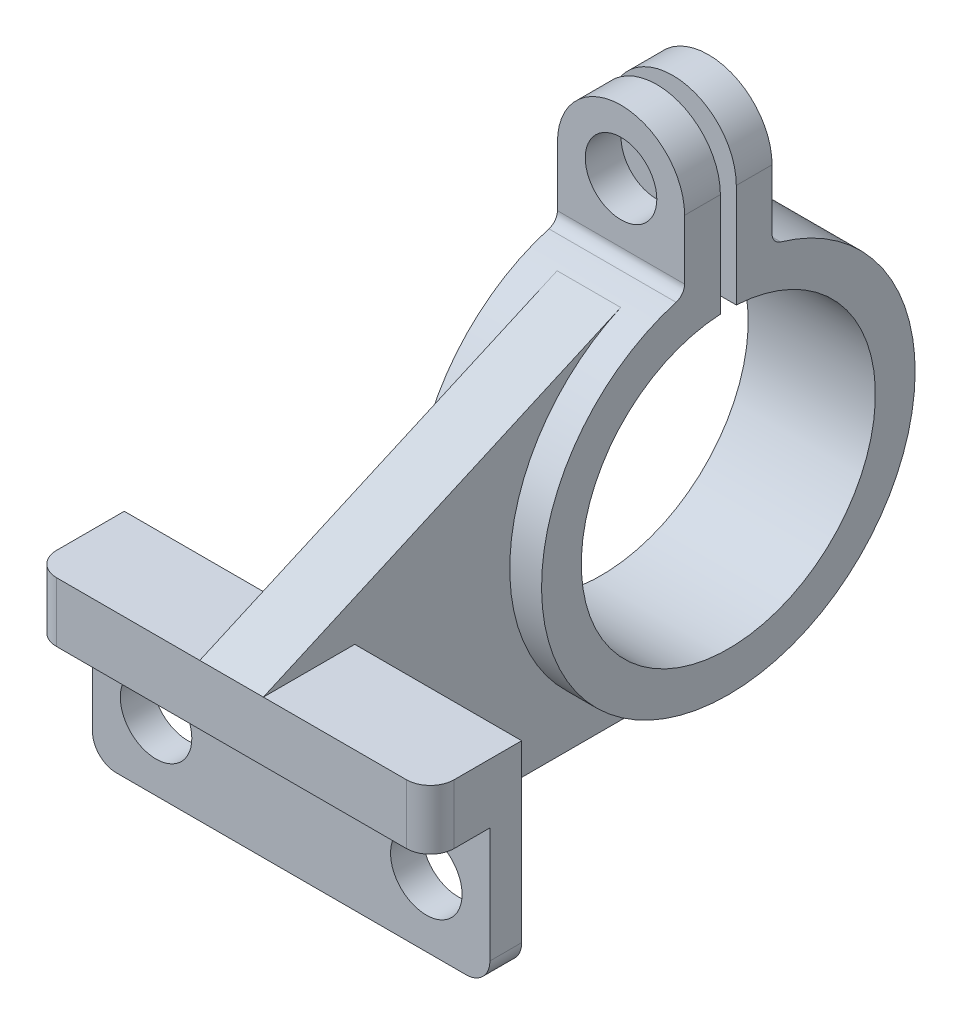
ISO-10303-21;
HEADER;
FILE_DESCRIPTION(('STEP AP214'),'2;1');
FILE_NAME('part.step','',(''),(''),'','','');
FILE_SCHEMA(('AUTOMOTIVE_DESIGN { 1 0 10303 214 1 1 1 1 }'));
ENDSEC;
DATA;
#1=APPLICATION_CONTEXT('core data for automotive mechanical design processes');
#2=APPLICATION_PROTOCOL_DEFINITION('international standard','automotive_design',2000,#1);
#3=PRODUCT_CONTEXT('',#1,'mechanical');
#4=PRODUCT('Part','Part','',(#3));
#5=PRODUCT_RELATED_PRODUCT_CATEGORY('part','',(#4));
#6=PRODUCT_DEFINITION_FORMATION('','',#4);
#7=PRODUCT_DEFINITION_CONTEXT('part definition',#1,'design');
#8=PRODUCT_DEFINITION('design','',#6,#7);
#9=PRODUCT_DEFINITION_SHAPE('','',#8);
#10=(LENGTH_UNIT() NAMED_UNIT(*) SI_UNIT(.MILLI.,.METRE.));
#11=(NAMED_UNIT(*) PLANE_ANGLE_UNIT() SI_UNIT($,.RADIAN.));
#12=(NAMED_UNIT(*) SI_UNIT($,.STERADIAN.) SOLID_ANGLE_UNIT());
#13=UNCERTAINTY_MEASURE_WITH_UNIT(LENGTH_MEASURE(1.E-05),#10,'distance_accuracy_value','');
#14=(GEOMETRIC_REPRESENTATION_CONTEXT(3) GLOBAL_UNCERTAINTY_ASSIGNED_CONTEXT((#13)) GLOBAL_UNIT_ASSIGNED_CONTEXT((#10,
#11,#12)) REPRESENTATION_CONTEXT('',''));
#15=CARTESIAN_POINT('',(0.,0.,0.));
#16=DIRECTION('',(0.,0.,1.));
#17=DIRECTION('',(1.,0.,0.));
#18=AXIS2_PLACEMENT_3D('',#15,#16,#17);
#19=CARTESIAN_POINT('',(0.,63.,11.));
#20=DIRECTION('',(0.,0.,-1.));
#21=DIRECTION('',(-1.,0.,0.));
#22=AXIS2_PLACEMENT_3D('',#19,#20,#21);
#23=CYLINDRICAL_SURFACE('',#22,16.);
#24=DIRECTION('',(0.,0.,-1.));
#25=VECTOR('',#24,1.);
#26=CARTESIAN_POINT('',(-16.,63.,11.));
#27=LINE('',#26,#25);
#28=CARTESIAN_POINT('',(-16.,63.,-2.));
#29=VERTEX_POINT('',#28);
#30=CARTESIAN_POINT('',(-16.,63.,-11.));
#31=VERTEX_POINT('',#30);
#32=EDGE_CURVE('E359',#29,#31,#27,.T.);
#33=ORIENTED_EDGE('',*,*,#32,.F.);
#34=CARTESIAN_POINT('',(0.,63.,-2.));
#35=DIRECTION('',(0.,0.,-1.));
#36=DIRECTION('',(0.,1.,0.));
#37=AXIS2_PLACEMENT_3D('',#34,#35,#36);
#38=CIRCLE('',#37,16.);
#39=CARTESIAN_POINT('',(16.,63.,-2.));
#40=VERTEX_POINT('',#39);
#41=EDGE_CURVE('E341',#29,#40,#38,.T.);
#42=ORIENTED_EDGE('',*,*,#41,.T.);
#43=DIRECTION('',(0.,0.,-1.));
#44=VECTOR('',#43,1.);
#45=CARTESIAN_POINT('',(16.,63.,11.));
#46=LINE('',#45,#44);
#47=CARTESIAN_POINT('',(16.,63.,-11.));
#48=VERTEX_POINT('',#47);
#49=EDGE_CURVE('E369',#40,#48,#46,.T.);
#50=ORIENTED_EDGE('',*,*,#49,.T.);
#51=CARTESIAN_POINT('',(0.,63.,-11.));
#52=DIRECTION('',(0.,0.,1.));
#53=DIRECTION('',(-1.,0.,0.));
#54=AXIS2_PLACEMENT_3D('',#51,#52,#53);
#55=CIRCLE('',#54,16.);
#56=EDGE_CURVE('E361',#48,#31,#55,.T.);
#57=ORIENTED_EDGE('',*,*,#56,.T.);
#58=EDGE_LOOP('',(#33,#42,#50,#57));
#59=FACE_BOUND('',#58,.T.);
#60=ADVANCED_FACE('F35',(#59),#23,.T.);
#61=CARTESIAN_POINT('',(0.,63.,11.));
#62=DIRECTION('',(0.,0.,-1.));
#63=DIRECTION('',(-1.,0.,0.));
#64=AXIS2_PLACEMENT_3D('',#61,#62,#63);
#65=CYLINDRICAL_SURFACE('',#64,9.);
#66=CARTESIAN_POINT('',(0.,63.,-2.));
#67=DIRECTION('',(0.,0.,-1.));
#68=DIRECTION('',(0.,1.,0.));
#69=AXIS2_PLACEMENT_3D('',#66,#67,#68);
#70=CIRCLE('',#69,9.);
#71=CARTESIAN_POINT('',(0.,72.,-2.));
#72=VERTEX_POINT('',#71);
#73=EDGE_CURVE('E340',#72,#72,#70,.T.);
#74=ORIENTED_EDGE('',*,*,#73,.F.);
#75=EDGE_LOOP('',(#74));
#76=FACE_BOUND('',#75,.T.);
#77=CARTESIAN_POINT('',(0.,63.,-11.));
#78=DIRECTION('',(0.,0.,1.));
#79=DIRECTION('',(1.,0.,0.));
#80=AXIS2_PLACEMENT_3D('',#77,#78,#79);
#81=CIRCLE('',#80,9.);
#82=CARTESIAN_POINT('',(9.,63.,-11.));
#83=VERTEX_POINT('',#82);
#84=EDGE_CURVE('E344',#83,#83,#81,.T.);
#85=ORIENTED_EDGE('',*,*,#84,.F.);
#86=EDGE_LOOP('',(#85));
#87=FACE_BOUND('',#86,.T.);
#88=ADVANCED_FACE('F458',(#76,#87),#65,.F.);
#89=CARTESIAN_POINT('',(16.,0.,0.));
#90=DIRECTION('',(-1.,0.,0.));
#91=DIRECTION('',(0.,0.,1.));
#92=AXIS2_PLACEMENT_3D('',#89,#90,#91);
#93=CYLINDRICAL_SURFACE('',#92,47.);
#94=DIRECTION('',(-1.,0.,0.));
#95=VECTOR('',#94,1.);
#96=CARTESIAN_POINT('',(8.,42.9511849566096,19.0839123563047));
#97=LINE('',#96,#95);
#98=CARTESIAN_POINT('',(8.,42.9511849636541,19.0839123404499));
#99=VERTEX_POINT('',#98);
#100=CARTESIAN_POINT('',(-8.,42.9511849636541,19.0839123404499));
#101=VERTEX_POINT('',#100);
#102=EDGE_CURVE('E55',#99,#101,#97,.T.);
#103=ORIENTED_EDGE('',*,*,#102,.F.);
#104=CARTESIAN_POINT('',(8.,-3.68080566026663E-09,1.73493233668331E-08));
#105=DIRECTION('',(-1.,0.,0.));
#106=DIRECTION('',(0.,0.,-1.));
#107=AXIS2_PLACEMENT_3D('',#104,#105,#106);
#108=CIRCLE('',#107,46.9999999963192);
#109=CARTESIAN_POINT('',(8.,-47.,0.));
#110=VERTEX_POINT('',#109);
#111=EDGE_CURVE('E50',#110,#99,#108,.T.);
#112=ORIENTED_EDGE('',*,*,#111,.F.);
#113=DIRECTION('',(-1.,0.,0.));
#114=VECTOR('',#113,1.);
#115=CARTESIAN_POINT('',(8.,-47.,0.));
#116=LINE('',#115,#114);
#117=CARTESIAN_POINT('',(-8.,-47.,0.));
#118=VERTEX_POINT('',#117);
#119=EDGE_CURVE('E319',#110,#118,#116,.T.);
#120=ORIENTED_EDGE('',*,*,#119,.T.);
#121=CARTESIAN_POINT('',(-8.,-3.68080566026663E-09,1.73493233668331E-08));
#122=DIRECTION('',(-1.,0.,0.));
#123=DIRECTION('',(0.,0.,-1.));
#124=AXIS2_PLACEMENT_3D('',#121,#122,#123);
#125=CIRCLE('',#124,46.9999999963192);
#126=EDGE_CURVE('E313',#118,#101,#125,.T.);
#127=ORIENTED_EDGE('',*,*,#126,.T.);
#128=EDGE_LOOP('',(#103,#112,#120,#127));
#129=FACE_BOUND('',#128,.T.);
#130=CARTESIAN_POINT('',(-16.,0.,0.));
#131=DIRECTION('',(1.,0.,0.));
#132=DIRECTION('',(0.,0.,-1.));
#133=AXIS2_PLACEMENT_3D('',#130,#131,#132);
#134=CIRCLE('',#133,47.);
#135=CARTESIAN_POINT('',(-16.,45.12,13.16));
#136=VERTEX_POINT('',#135);
#137=CARTESIAN_POINT('',(-16.,45.12,-13.16));
#138=VERTEX_POINT('',#137);
#139=EDGE_CURVE('E377',#136,#138,#134,.T.);
#140=ORIENTED_EDGE('',*,*,#139,.T.);
#141=DIRECTION('',(-1.,0.,0.));
#142=VECTOR('',#141,1.);
#143=CARTESIAN_POINT('',(16.,45.12,-13.16));
#144=LINE('',#143,#142);
#145=CARTESIAN_POINT('',(16.,45.12,-13.16));
#146=VERTEX_POINT('',#145);
#147=EDGE_CURVE('E391',#138,#146,#144,.F.);
#148=ORIENTED_EDGE('',*,*,#147,.T.);
#149=CARTESIAN_POINT('',(16.,0.,0.));
#150=DIRECTION('',(1.,0.,0.));
#151=DIRECTION('',(0.,0.,-1.));
#152=AXIS2_PLACEMENT_3D('',#149,#150,#151);
#153=CIRCLE('',#152,47.);
#154=CARTESIAN_POINT('',(16.,45.12,13.16));
#155=VERTEX_POINT('',#154);
#156=EDGE_CURVE('E380',#155,#146,#153,.T.);
#157=ORIENTED_EDGE('',*,*,#156,.F.);
#158=DIRECTION('',(-1.,0.,0.));
#159=VECTOR('',#158,1.);
#160=CARTESIAN_POINT('',(16.,45.12,13.16));
#161=LINE('',#160,#159);
#162=EDGE_CURVE('E383',#155,#136,#161,.T.);
#163=ORIENTED_EDGE('',*,*,#162,.T.);
#164=EDGE_LOOP('',(#140,#148,#157,#163));
#165=FACE_BOUND('',#164,.T.);
#166=ADVANCED_FACE('F412',(#129,#165),#93,.T.);
#167=CARTESIAN_POINT('',(16.,0.,0.));
#168=DIRECTION('',(1.,0.,0.));
#169=DIRECTION('',(0.,0.,-1.));
#170=AXIS2_PLACEMENT_3D('',#167,#168,#169);
#171=PLANE('',#170);
#172=DIRECTION('',(0.,1.,0.));
#173=VECTOR('',#172,1.);
#174=CARTESIAN_POINT('',(16.,36.9459064038223,-2.));
#175=LINE('',#174,#173);
#176=CARTESIAN_POINT('',(16.,36.9459064038223,-2.));
#177=VERTEX_POINT('',#176);
#178=EDGE_CURVE('E326',#177,#40,#175,.T.);
#179=ORIENTED_EDGE('',*,*,#178,.F.);
#180=CARTESIAN_POINT('',(16.,0.,0.));
#181=DIRECTION('',(1.,0.,0.));
#182=DIRECTION('',(0.,0.,-1.));
#183=AXIS2_PLACEMENT_3D('',#180,#181,#182);
#184=CIRCLE('',#183,37.);
#185=CARTESIAN_POINT('',(16.,36.9459064038223,2.));
#186=VERTEX_POINT('',#185);
#187=EDGE_CURVE('E374',#186,#177,#184,.T.);
#188=ORIENTED_EDGE('',*,*,#187,.F.);
#189=DIRECTION('',(0.,-1.,0.));
#190=VECTOR('',#189,1.);
#191=CARTESIAN_POINT('',(16.,81.9459064038223,2.00000000000001));
#192=LINE('',#191,#190);
#193=CARTESIAN_POINT('',(16.,63.,2.));
#194=VERTEX_POINT('',#193);
#195=EDGE_CURVE('E321',#194,#186,#192,.T.);
#196=ORIENTED_EDGE('',*,*,#195,.F.);
#197=CARTESIAN_POINT('',(16.,63.,11.));
#198=VERTEX_POINT('',#197);
#199=EDGE_CURVE('E370',#198,#194,#46,.T.);
#200=ORIENTED_EDGE('',*,*,#199,.F.);
#201=DIRECTION('',(0.,1.,0.));
#202=VECTOR('',#201,1.);
#203=CARTESIAN_POINT('',(16.,63.,11.));
#204=LINE('',#203,#202);
#205=CARTESIAN_POINT('',(16.,48.,11.));
#206=VERTEX_POINT('',#205);
#207=EDGE_CURVE('E351',#206,#198,#204,.T.);
#208=ORIENTED_EDGE('',*,*,#207,.F.);
#209=CARTESIAN_POINT('',(16.,48.,14.));
#210=DIRECTION('',(1.,0.,0.));
#211=DIRECTION('',(0.,0.,-1.));
#212=AXIS2_PLACEMENT_3D('',#209,#210,#211);
#213=CIRCLE('',#212,3.);
#214=EDGE_CURVE('E43',#206,#155,#213,.F.);
#215=ORIENTED_EDGE('',*,*,#214,.T.);
#216=ORIENTED_EDGE('',*,*,#156,.T.);
#217=CARTESIAN_POINT('',(16.,48.,-14.));
#218=DIRECTION('',(1.,0.,0.));
#219=DIRECTION('',(0.,0.,-1.));
#220=AXIS2_PLACEMENT_3D('',#217,#218,#219);
#221=CIRCLE('',#220,3.);
#222=CARTESIAN_POINT('',(16.,48.,-11.));
#223=VERTEX_POINT('',#222);
#224=EDGE_CURVE('E399',#146,#223,#221,.F.);
#225=ORIENTED_EDGE('',*,*,#224,.T.);
#226=DIRECTION('',(0.,1.,0.));
#227=VECTOR('',#226,1.);
#228=CARTESIAN_POINT('',(16.,63.,-11.));
#229=LINE('',#228,#227);
#230=EDGE_CURVE('E348',#223,#48,#229,.T.);
#231=ORIENTED_EDGE('',*,*,#230,.T.);
#232=ORIENTED_EDGE('',*,*,#49,.F.);
#233=EDGE_LOOP('',(#179,#188,#196,#200,#208,#215,#216,#225,#231,#232));
#234=FACE_BOUND('',#233,.T.);
#235=ADVANCED_FACE('F406',(#234),#171,.T.);
#236=CARTESIAN_POINT('',(-16.,0.,0.));
#237=DIRECTION('',(1.,0.,0.));
#238=DIRECTION('',(0.,0.,-1.));
#239=AXIS2_PLACEMENT_3D('',#236,#237,#238);
#240=PLANE('',#239);
#241=CARTESIAN_POINT('',(-16.,0.,0.));
#242=DIRECTION('',(1.,0.,0.));
#243=DIRECTION('',(0.,0.,-1.));
#244=AXIS2_PLACEMENT_3D('',#241,#242,#243);
#245=CIRCLE('',#244,37.);
#246=CARTESIAN_POINT('',(-16.,36.9459064038223,2.));
#247=VERTEX_POINT('',#246);
#248=CARTESIAN_POINT('',(-16.,36.9459064038223,-2.));
#249=VERTEX_POINT('',#248);
#250=EDGE_CURVE('E373',#247,#249,#245,.T.);
#251=ORIENTED_EDGE('',*,*,#250,.T.);
#252=DIRECTION('',(0.,1.,0.));
#253=VECTOR('',#252,1.);
#254=CARTESIAN_POINT('',(-16.,36.9459064038223,-2.));
#255=LINE('',#254,#253);
#256=EDGE_CURVE('E325',#249,#29,#255,.T.);
#257=ORIENTED_EDGE('',*,*,#256,.T.);
#258=ORIENTED_EDGE('',*,*,#32,.T.);
#259=DIRECTION('',(0.,-1.,0.));
#260=VECTOR('',#259,1.);
#261=CARTESIAN_POINT('',(-16.,37.,-11.));
#262=LINE('',#261,#260);
#263=CARTESIAN_POINT('',(-16.,48.,-11.));
#264=VERTEX_POINT('',#263);
#265=EDGE_CURVE('E354',#31,#264,#262,.T.);
#266=ORIENTED_EDGE('',*,*,#265,.T.);
#267=CARTESIAN_POINT('',(-16.,48.,-14.));
#268=DIRECTION('',(1.,0.,0.));
#269=DIRECTION('',(0.,0.,-1.));
#270=AXIS2_PLACEMENT_3D('',#267,#268,#269);
#271=CIRCLE('',#270,3.);
#272=EDGE_CURVE('E401',#264,#138,#271,.T.);
#273=ORIENTED_EDGE('',*,*,#272,.T.);
#274=ORIENTED_EDGE('',*,*,#139,.F.);
#275=CARTESIAN_POINT('',(-16.,48.,14.));
#276=DIRECTION('',(1.,0.,0.));
#277=DIRECTION('',(0.,0.,-1.));
#278=AXIS2_PLACEMENT_3D('',#275,#276,#277);
#279=CIRCLE('',#278,3.);
#280=CARTESIAN_POINT('',(-16.,48.,11.));
#281=VERTEX_POINT('',#280);
#282=EDGE_CURVE('E11',#136,#281,#279,.T.);
#283=ORIENTED_EDGE('',*,*,#282,.T.);
#284=DIRECTION('',(0.,-1.,0.));
#285=VECTOR('',#284,1.);
#286=CARTESIAN_POINT('',(-16.,37.,11.));
#287=LINE('',#286,#285);
#288=CARTESIAN_POINT('',(-16.,63.,11.));
#289=VERTEX_POINT('',#288);
#290=EDGE_CURVE('E356',#289,#281,#287,.T.);
#291=ORIENTED_EDGE('',*,*,#290,.F.);
#292=CARTESIAN_POINT('',(-16.,63.,2.));
#293=VERTEX_POINT('',#292);
#294=EDGE_CURVE('E366',#289,#293,#27,.T.);
#295=ORIENTED_EDGE('',*,*,#294,.T.);
#296=DIRECTION('',(0.,-1.,0.));
#297=VECTOR('',#296,1.);
#298=CARTESIAN_POINT('',(-16.,81.9459064038223,2.00000000000001));
#299=LINE('',#298,#297);
#300=EDGE_CURVE('E322',#293,#247,#299,.T.);
#301=ORIENTED_EDGE('',*,*,#300,.T.);
#302=EDGE_LOOP('',(#251,#257,#258,#266,#273,#274,#283,#291,#295,#301));
#303=FACE_BOUND('',#302,.T.);
#304=ADVANCED_FACE('F418',(#303),#240,.F.);
#305=CARTESIAN_POINT('',(16.,0.,0.));
#306=DIRECTION('',(-1.,0.,0.));
#307=DIRECTION('',(0.,0.,1.));
#308=AXIS2_PLACEMENT_3D('',#305,#306,#307);
#309=CYLINDRICAL_SURFACE('',#308,37.);
#310=DIRECTION('',(1.,0.,0.));
#311=VECTOR('',#310,1.);
#312=CARTESIAN_POINT('',(-16.,36.9459064038223,-2.));
#313=LINE('',#312,#311);
#314=EDGE_CURVE('E332',#249,#177,#313,.T.);
#315=ORIENTED_EDGE('',*,*,#314,.F.);
#316=ORIENTED_EDGE('',*,*,#250,.F.);
#317=DIRECTION('',(1.,0.,0.));
#318=VECTOR('',#317,1.);
#319=CARTESIAN_POINT('',(-16.,36.9459064038223,2.));
#320=LINE('',#319,#318);
#321=EDGE_CURVE('E329',#247,#186,#320,.T.);
#322=ORIENTED_EDGE('',*,*,#321,.T.);
#323=ORIENTED_EDGE('',*,*,#187,.T.);
#324=EDGE_LOOP('',(#315,#316,#322,#323));
#325=FACE_BOUND('',#324,.T.);
#326=ADVANCED_FACE('F429',(#325),#309,.F.);
#327=CARTESIAN_POINT('',(0.,63.,11.));
#328=DIRECTION('',(0.,0.,-1.));
#329=DIRECTION('',(-1.,0.,0.));
#330=AXIS2_PLACEMENT_3D('',#327,#328,#329);
#331=PLANE('',#330);
#332=CARTESIAN_POINT('',(0.,63.,11.));
#333=DIRECTION('',(0.,0.,1.));
#334=DIRECTION('',(1.,0.,0.));
#335=AXIS2_PLACEMENT_3D('',#332,#333,#334);
#336=CIRCLE('',#335,9.);
#337=CARTESIAN_POINT('',(9.,63.,11.));
#338=VERTEX_POINT('',#337);
#339=EDGE_CURVE('E345',#338,#338,#336,.T.);
#340=ORIENTED_EDGE('',*,*,#339,.F.);
#341=EDGE_LOOP('',(#340));
#342=FACE_BOUND('',#341,.T.);
#343=ORIENTED_EDGE('',*,*,#290,.T.);
#344=DIRECTION('',(1.,0.,0.));
#345=VECTOR('',#344,1.);
#346=CARTESIAN_POINT('',(16.,48.,11.));
#347=LINE('',#346,#345);
#348=EDGE_CURVE('E396',#281,#206,#347,.T.);
#349=ORIENTED_EDGE('',*,*,#348,.T.);
#350=ORIENTED_EDGE('',*,*,#207,.T.);
#351=CARTESIAN_POINT('',(0.,63.,11.));
#352=DIRECTION('',(0.,0.,1.));
#353=DIRECTION('',(-1.,0.,0.));
#354=AXIS2_PLACEMENT_3D('',#351,#352,#353);
#355=CIRCLE('',#354,16.);
#356=EDGE_CURVE('E353',#198,#289,#355,.T.);
#357=ORIENTED_EDGE('',*,*,#356,.T.);
#358=EDGE_LOOP('',(#343,#349,#350,#357));
#359=FACE_BOUND('',#358,.T.);
#360=ADVANCED_FACE('F420',(#342,#359),#331,.F.);
#361=CARTESIAN_POINT('',(0.,63.,-11.));
#362=DIRECTION('',(0.,0.,-1.));
#363=DIRECTION('',(-1.,0.,0.));
#364=AXIS2_PLACEMENT_3D('',#361,#362,#363);
#365=PLANE('',#364);
#366=ORIENTED_EDGE('',*,*,#84,.T.);
#367=EDGE_LOOP('',(#366));
#368=FACE_BOUND('',#367,.T.);
#369=ORIENTED_EDGE('',*,*,#230,.F.);
#370=DIRECTION('',(-1.,0.,0.));
#371=VECTOR('',#370,1.);
#372=CARTESIAN_POINT('',(0.,48.,-11.));
#373=LINE('',#372,#371);
#374=EDGE_CURVE('E394',#223,#264,#373,.T.);
#375=ORIENTED_EDGE('',*,*,#374,.T.);
#376=ORIENTED_EDGE('',*,*,#265,.F.);
#377=ORIENTED_EDGE('',*,*,#56,.F.);
#378=EDGE_LOOP('',(#369,#375,#376,#377));
#379=FACE_BOUND('',#378,.T.);
#380=ADVANCED_FACE('F442',(#368,#379),#365,.T.);
#381=ORIENTED_EDGE('',*,*,#199,.T.);
#382=CARTESIAN_POINT('',(0.,63.,2.));
#383=DIRECTION('',(0.,0.,1.));
#384=DIRECTION('',(0.,-1.,0.));
#385=AXIS2_PLACEMENT_3D('',#382,#383,#384);
#386=CIRCLE('',#385,16.);
#387=EDGE_CURVE('E337',#194,#293,#386,.T.);
#388=ORIENTED_EDGE('',*,*,#387,.T.);
#389=ORIENTED_EDGE('',*,*,#294,.F.);
#390=ORIENTED_EDGE('',*,*,#356,.F.);
#391=EDGE_LOOP('',(#381,#388,#389,#390));
#392=FACE_BOUND('',#391,.T.);
#393=ADVANCED_FACE('F424',(#392),#23,.T.);
#394=CARTESIAN_POINT('',(0.,63.,2.));
#395=DIRECTION('',(0.,0.,1.));
#396=DIRECTION('',(0.,-1.,0.));
#397=AXIS2_PLACEMENT_3D('',#394,#395,#396);
#398=CIRCLE('',#397,9.);
#399=CARTESIAN_POINT('',(0.,54.,2.));
#400=VERTEX_POINT('',#399);
#401=EDGE_CURVE('E334',#400,#400,#398,.T.);
#402=ORIENTED_EDGE('',*,*,#401,.F.);
#403=EDGE_LOOP('',(#402));
#404=FACE_BOUND('',#403,.T.);
#405=ORIENTED_EDGE('',*,*,#339,.T.);
#406=EDGE_LOOP('',(#405));
#407=FACE_BOUND('',#406,.T.);
#408=ADVANCED_FACE('F465',(#404,#407),#65,.F.);
#409=CARTESIAN_POINT('',(-16.,81.9459064038223,2.00000000000001));
#410=DIRECTION('',(0.,0.,1.));
#411=DIRECTION('',(0.,-1.,0.));
#412=AXIS2_PLACEMENT_3D('',#409,#410,#411);
#413=PLANE('',#412);
#414=ORIENTED_EDGE('',*,*,#401,.T.);
#415=EDGE_LOOP('',(#414));
#416=FACE_BOUND('',#415,.T.);
#417=ORIENTED_EDGE('',*,*,#195,.T.);
#418=ORIENTED_EDGE('',*,*,#321,.F.);
#419=ORIENTED_EDGE('',*,*,#300,.F.);
#420=ORIENTED_EDGE('',*,*,#387,.F.);
#421=EDGE_LOOP('',(#417,#418,#419,#420));
#422=FACE_BOUND('',#421,.T.);
#423=ADVANCED_FACE('F453',(#416,#422),#413,.F.);
#424=CARTESIAN_POINT('',(-16.,36.9459064038223,-2.));
#425=DIRECTION('',(0.,0.,-1.));
#426=DIRECTION('',(0.,1.,0.));
#427=AXIS2_PLACEMENT_3D('',#424,#425,#426);
#428=PLANE('',#427);
#429=ORIENTED_EDGE('',*,*,#73,.T.);
#430=EDGE_LOOP('',(#429));
#431=FACE_BOUND('',#430,.T.);
#432=ORIENTED_EDGE('',*,*,#256,.F.);
#433=ORIENTED_EDGE('',*,*,#314,.T.);
#434=ORIENTED_EDGE('',*,*,#178,.T.);
#435=ORIENTED_EDGE('',*,*,#41,.F.);
#436=EDGE_LOOP('',(#432,#433,#434,#435));
#437=FACE_BOUND('',#436,.T.);
#438=ADVANCED_FACE('F432',(#431,#437),#428,.F.);
#439=CARTESIAN_POINT('',(16.,48.,-14.));
#440=DIRECTION('',(-1.,0.,0.));
#441=DIRECTION('',(0.,0.,1.));
#442=AXIS2_PLACEMENT_3D('',#439,#440,#441);
#443=CYLINDRICAL_SURFACE('',#442,3.);
#444=ORIENTED_EDGE('',*,*,#272,.F.);
#445=ORIENTED_EDGE('',*,*,#374,.F.);
#446=ORIENTED_EDGE('',*,*,#224,.F.);
#447=ORIENTED_EDGE('',*,*,#147,.F.);
#448=EDGE_LOOP('',(#444,#445,#446,#447));
#449=FACE_BOUND('',#448,.T.);
#450=ADVANCED_FACE('F446',(#449),#443,.F.);
#451=CARTESIAN_POINT('',(16.,48.,14.));
#452=DIRECTION('',(-1.,0.,0.));
#453=DIRECTION('',(0.,0.,1.));
#454=AXIS2_PLACEMENT_3D('',#451,#452,#453);
#455=CYLINDRICAL_SURFACE('',#454,3.);
#456=ORIENTED_EDGE('',*,*,#282,.F.);
#457=ORIENTED_EDGE('',*,*,#162,.F.);
#458=ORIENTED_EDGE('',*,*,#214,.F.);
#459=ORIENTED_EDGE('',*,*,#348,.F.);
#460=EDGE_LOOP('',(#456,#457,#458,#459));
#461=FACE_BOUND('',#460,.T.);
#462=ADVANCED_FACE('F37',(#461),#455,.F.);
#463=CARTESIAN_POINT('',(8.,-47.,0.));
#464=DIRECTION('',(0.,1.,0.));
#465=DIRECTION('',(0.,0.,1.));
#466=AXIS2_PLACEMENT_3D('',#463,#464,#465);
#467=PLANE('',#466);
#468=DIRECTION('',(0.,0.,-1.));
#469=VECTOR('',#468,1.);
#470=CARTESIAN_POINT('',(-8.,-47.,0.));
#471=LINE('',#470,#469);
#472=CARTESIAN_POINT('',(-8.,-47.,86.));
#473=VERTEX_POINT('',#472);
#474=EDGE_CURVE('E310',#473,#118,#471,.T.);
#475=ORIENTED_EDGE('',*,*,#474,.T.);
#476=ORIENTED_EDGE('',*,*,#119,.F.);
#477=DIRECTION('',(0.,0.,-1.));
#478=VECTOR('',#477,1.);
#479=CARTESIAN_POINT('',(8.,-47.,0.));
#480=LINE('',#479,#478);
#481=CARTESIAN_POINT('',(8.,-47.,86.));
#482=VERTEX_POINT('',#481);
#483=EDGE_CURVE('E299',#482,#110,#480,.T.);
#484=ORIENTED_EDGE('',*,*,#483,.F.);
#485=DIRECTION('',(-1.,0.,0.));
#486=VECTOR('',#485,1.);
#487=CARTESIAN_POINT('',(50.,-47.,86.));
#488=LINE('',#487,#486);
#489=CARTESIAN_POINT('',(44.,-47.,86.));
#490=VERTEX_POINT('',#489);
#491=EDGE_CURVE('E256',#490,#482,#488,.T.);
#492=ORIENTED_EDGE('',*,*,#491,.F.);
#493=DIRECTION('',(0.,0.,-1.));
#494=VECTOR('',#493,1.);
#495=CARTESIAN_POINT('',(44.,-47.,94.));
#496=LINE('',#495,#494);
#497=CARTESIAN_POINT('',(44.,-47.,94.));
#498=VERTEX_POINT('',#497);
#499=EDGE_CURVE('E271',#490,#498,#496,.F.);
#500=ORIENTED_EDGE('',*,*,#499,.T.);
#501=DIRECTION('',(-1.,0.,0.));
#502=VECTOR('',#501,1.);
#503=CARTESIAN_POINT('',(50.,-47.,94.));
#504=LINE('',#503,#502);
#505=CARTESIAN_POINT('',(-44.,-47.,94.));
#506=VERTEX_POINT('',#505);
#507=EDGE_CURVE('E258',#498,#506,#504,.T.);
#508=ORIENTED_EDGE('',*,*,#507,.T.);
#509=DIRECTION('',(0.,0.,-1.));
#510=VECTOR('',#509,1.);
#511=CARTESIAN_POINT('',(-44.,-47.,94.));
#512=LINE('',#511,#510);
#513=CARTESIAN_POINT('',(-44.,-47.,86.));
#514=VERTEX_POINT('',#513);
#515=EDGE_CURVE('E268',#506,#514,#512,.T.);
#516=ORIENTED_EDGE('',*,*,#515,.T.);
#517=EDGE_CURVE('E222',#473,#514,#488,.T.);
#518=ORIENTED_EDGE('',*,*,#517,.F.);
#519=EDGE_LOOP('',(#475,#476,#484,#492,#500,#508,#516,#518));
#520=FACE_BOUND('',#519,.T.);
#521=ADVANCED_FACE('F452',(#520),#467,.F.);
#522=CARTESIAN_POINT('',(8.,2.99999999999998,109.));
#523=DIRECTION('',(0.,-0.913854999226682,-0.406040688094679));
#524=DIRECTION('',(0.,0.406040688094679,-0.913854999226682));
#525=AXIS2_PLACEMENT_3D('',#522,#523,#524);
#526=PLANE('',#525);
#527=DIRECTION('',(0.,-0.406040688094679,0.913854999226682));
#528=VECTOR('',#527,1.);
#529=CARTESIAN_POINT('',(-8.,2.99999999999998,109.));
#530=LINE('',#529,#528);
#531=CARTESIAN_POINT('',(-8.,2.99999999999998,109.));
#532=VERTEX_POINT('',#531);
#533=EDGE_CURVE('E297',#101,#532,#530,.T.);
#534=ORIENTED_EDGE('',*,*,#533,.T.);
#535=DIRECTION('',(-1.,0.,0.));
#536=VECTOR('',#535,1.);
#537=CARTESIAN_POINT('',(8.,2.99999999999998,109.));
#538=LINE('',#537,#536);
#539=CARTESIAN_POINT('',(8.,2.99999999999998,109.));
#540=VERTEX_POINT('',#539);
#541=EDGE_CURVE('E304',#540,#532,#538,.T.);
#542=ORIENTED_EDGE('',*,*,#541,.F.);
#543=DIRECTION('',(0.,-0.406040688094679,0.913854999226682));
#544=VECTOR('',#543,1.);
#545=CARTESIAN_POINT('',(8.,2.99999999999998,109.));
#546=LINE('',#545,#544);
#547=EDGE_CURVE('E302',#99,#540,#546,.T.);
#548=ORIENTED_EDGE('',*,*,#547,.F.);
#549=ORIENTED_EDGE('',*,*,#102,.T.);
#550=EDGE_LOOP('',(#534,#542,#548,#549));
#551=FACE_BOUND('',#550,.T.);
#552=ADVANCED_FACE('F486',(#551),#526,.F.);
#553=CARTESIAN_POINT('',(8.,-3.68080566026663E-09,1.73493233668331E-08));
#554=DIRECTION('',(1.,0.,0.));
#555=DIRECTION('',(0.,0.,-1.));
#556=AXIS2_PLACEMENT_3D('',#553,#554,#555);
#557=PLANE('',#556);
#558=DIRECTION('',(0.,0.,-1.));
#559=VECTOR('',#558,1.);
#560=CARTESIAN_POINT('',(8.,2.99999999999998,86.));
#561=LINE('',#560,#559);
#562=CARTESIAN_POINT('',(8.,2.99999999999998,86.));
#563=VERTEX_POINT('',#562);
#564=EDGE_CURVE('E295',#540,#563,#561,.T.);
#565=ORIENTED_EDGE('',*,*,#564,.T.);
#566=DIRECTION('',(0.,-1.,0.));
#567=VECTOR('',#566,1.);
#568=CARTESIAN_POINT('',(8.,-47.,86.));
#569=LINE('',#568,#567);
#570=EDGE_CURVE('E219',#563,#482,#569,.T.);
#571=ORIENTED_EDGE('',*,*,#570,.T.);
#572=ORIENTED_EDGE('',*,*,#483,.T.);
#573=ORIENTED_EDGE('',*,*,#111,.T.);
#574=ORIENTED_EDGE('',*,*,#547,.T.);
#575=EDGE_LOOP('',(#565,#571,#572,#573,#574));
#576=FACE_BOUND('',#575,.T.);
#577=ADVANCED_FACE('F490',(#576),#557,.T.);
#578=CARTESIAN_POINT('',(-8.,-3.68080566026663E-09,1.73493233668331E-08));
#579=DIRECTION('',(1.,0.,0.));
#580=DIRECTION('',(0.,0.,-1.));
#581=AXIS2_PLACEMENT_3D('',#578,#579,#580);
#582=PLANE('',#581);
#583=DIRECTION('',(0.,0.,-1.));
#584=VECTOR('',#583,1.);
#585=CARTESIAN_POINT('',(-8.,2.99999999999998,86.));
#586=LINE('',#585,#584);
#587=CARTESIAN_POINT('',(-8.,2.99999999999998,86.));
#588=VERTEX_POINT('',#587);
#589=EDGE_CURVE('E294',#532,#588,#586,.T.);
#590=ORIENTED_EDGE('',*,*,#589,.F.);
#591=ORIENTED_EDGE('',*,*,#533,.F.);
#592=ORIENTED_EDGE('',*,*,#126,.F.);
#593=ORIENTED_EDGE('',*,*,#474,.F.);
#594=DIRECTION('',(0.,-1.,0.));
#595=VECTOR('',#594,1.);
#596=CARTESIAN_POINT('',(-8.,-47.,86.));
#597=LINE('',#596,#595);
#598=EDGE_CURVE('E307',#588,#473,#597,.T.);
#599=ORIENTED_EDGE('',*,*,#598,.F.);
#600=EDGE_LOOP('',(#590,#591,#592,#593,#599));
#601=FACE_BOUND('',#600,.T.);
#602=ADVANCED_FACE('F492',(#601),#582,.F.);
#603=CARTESIAN_POINT('',(50.,-47.,86.));
#604=DIRECTION('',(0.,0.,1.));
#605=DIRECTION('',(1.,0.,0.));
#606=AXIS2_PLACEMENT_3D('',#603,#604,#605);
#607=PLANE('',#606);
#608=CARTESIAN_POINT('',(-34.,-30.,86.));
#609=DIRECTION('',(0.,0.,1.));
#610=DIRECTION('',(1.,0.,0.));
#611=AXIS2_PLACEMENT_3D('',#608,#609,#610);
#612=CIRCLE('',#611,9.);
#613=CARTESIAN_POINT('',(-25.,-30.,86.));
#614=VERTEX_POINT('',#613);
#615=EDGE_CURVE('E239',#614,#614,#612,.F.);
#616=ORIENTED_EDGE('',*,*,#615,.F.);
#617=EDGE_LOOP('',(#616));
#618=FACE_BOUND('',#617,.T.);
#619=DIRECTION('',(-1.,0.,0.));
#620=VECTOR('',#619,1.);
#621=CARTESIAN_POINT('',(50.,2.99999999999998,86.));
#622=LINE('',#621,#620);
#623=CARTESIAN_POINT('',(-50.,2.99999999999998,86.));
#624=VERTEX_POINT('',#623);
#625=EDGE_CURVE('E223',#588,#624,#622,.T.);
#626=ORIENTED_EDGE('',*,*,#625,.F.);
#627=ORIENTED_EDGE('',*,*,#598,.T.);
#628=ORIENTED_EDGE('',*,*,#517,.T.);
#629=CARTESIAN_POINT('',(-44.,-41.,86.));
#630=DIRECTION('',(0.,0.,1.));
#631=DIRECTION('',(1.,0.,0.));
#632=AXIS2_PLACEMENT_3D('',#629,#630,#631);
#633=CIRCLE('',#632,6.);
#634=CARTESIAN_POINT('',(-50.,-41.,86.));
#635=VERTEX_POINT('',#634);
#636=EDGE_CURVE('E264',#514,#635,#633,.F.);
#637=ORIENTED_EDGE('',*,*,#636,.T.);
#638=DIRECTION('',(0.,1.,0.));
#639=VECTOR('',#638,1.);
#640=CARTESIAN_POINT('',(-50.,-47.,86.));
#641=LINE('',#640,#639);
#642=EDGE_CURVE('E238',#635,#624,#641,.T.);
#643=ORIENTED_EDGE('',*,*,#642,.T.);
#644=EDGE_LOOP('',(#626,#627,#628,#637,#643));
#645=FACE_BOUND('',#644,.T.);
#646=ADVANCED_FACE('F495',(#618,#645),#607,.F.);
#647=CARTESIAN_POINT('',(50.,2.99999999999998,86.));
#648=DIRECTION('',(0.,-1.,0.));
#649=DIRECTION('',(0.,0.,-1.));
#650=AXIS2_PLACEMENT_3D('',#647,#648,#649);
#651=PLANE('',#650);
#652=DIRECTION('',(-1.,0.,0.));
#653=VECTOR('',#652,1.);
#654=CARTESIAN_POINT('',(50.,2.99999999999998,109.));
#655=LINE('',#654,#653);
#656=CARTESIAN_POINT('',(-44.,2.99999999999998,109.));
#657=VERTEX_POINT('',#656);
#658=EDGE_CURVE('E252',#532,#657,#655,.T.);
#659=ORIENTED_EDGE('',*,*,#658,.F.);
#660=ORIENTED_EDGE('',*,*,#589,.T.);
#661=ORIENTED_EDGE('',*,*,#625,.T.);
#662=DIRECTION('',(0.,0.,1.));
#663=VECTOR('',#662,1.);
#664=CARTESIAN_POINT('',(-50.,2.99999999999998,86.));
#665=LINE('',#664,#663);
#666=CARTESIAN_POINT('',(-50.,2.99999999999998,103.));
#667=VERTEX_POINT('',#666);
#668=EDGE_CURVE('E242',#624,#667,#665,.T.);
#669=ORIENTED_EDGE('',*,*,#668,.T.);
#670=CARTESIAN_POINT('',(-44.,2.99999999999998,103.));
#671=DIRECTION('',(0.,-1.,0.));
#672=DIRECTION('',(0.,0.,-1.));
#673=AXIS2_PLACEMENT_3D('',#670,#671,#672);
#674=CIRCLE('',#673,6.);
#675=EDGE_CURVE('E291',#667,#657,#674,.F.);
#676=ORIENTED_EDGE('',*,*,#675,.T.);
#677=EDGE_LOOP('',(#659,#660,#661,#669,#676));
#678=FACE_BOUND('',#677,.T.);
#679=ADVANCED_FACE('F520',(#678),#651,.F.);
#680=CARTESIAN_POINT('',(50.,-12.,94.));
#681=DIRECTION('',(0.,0.,-1.));
#682=DIRECTION('',(-1.,0.,0.));
#683=AXIS2_PLACEMENT_3D('',#680,#681,#682);
#684=PLANE('',#683);
#685=CARTESIAN_POINT('',(-34.,-30.,94.));
#686=DIRECTION('',(0.,0.,1.));
#687=DIRECTION('',(1.,0.,0.));
#688=AXIS2_PLACEMENT_3D('',#685,#686,#687);
#689=CIRCLE('',#688,9.);
#690=CARTESIAN_POINT('',(-25.,-30.,94.));
#691=VERTEX_POINT('',#690);
#692=EDGE_CURVE('E551',#691,#691,#689,.T.);
#693=ORIENTED_EDGE('',*,*,#692,.F.);
#694=EDGE_LOOP('',(#693));
#695=FACE_BOUND('',#694,.T.);
#696=CARTESIAN_POINT('',(34.,-30.,94.));
#697=DIRECTION('',(0.,0.,1.));
#698=DIRECTION('',(1.,0.,0.));
#699=AXIS2_PLACEMENT_3D('',#696,#697,#698);
#700=CIRCLE('',#699,9.);
#701=CARTESIAN_POINT('',(43.,-30.,94.));
#702=VERTEX_POINT('',#701);
#703=EDGE_CURVE('E559',#702,#702,#700,.T.);
#704=ORIENTED_EDGE('',*,*,#703,.F.);
#705=EDGE_LOOP('',(#704));
#706=FACE_BOUND('',#705,.T.);
#707=ORIENTED_EDGE('',*,*,#507,.F.);
#708=CARTESIAN_POINT('',(44.,-41.,94.));
#709=DIRECTION('',(0.,0.,-1.));
#710=DIRECTION('',(-1.,0.,0.));
#711=AXIS2_PLACEMENT_3D('',#708,#709,#710);
#712=CIRCLE('',#711,6.);
#713=CARTESIAN_POINT('',(50.,-41.,94.));
#714=VERTEX_POINT('',#713);
#715=EDGE_CURVE('E275',#498,#714,#712,.F.);
#716=ORIENTED_EDGE('',*,*,#715,.T.);
#717=DIRECTION('',(0.,-1.,0.));
#718=VECTOR('',#717,1.);
#719=CARTESIAN_POINT('',(50.,-12.,94.));
#720=LINE('',#719,#718);
#721=CARTESIAN_POINT('',(50.,-12.,94.));
#722=VERTEX_POINT('',#721);
#723=EDGE_CURVE('E211',#722,#714,#720,.T.);
#724=ORIENTED_EDGE('',*,*,#723,.F.);
#725=DIRECTION('',(-1.,0.,0.));
#726=VECTOR('',#725,1.);
#727=CARTESIAN_POINT('',(50.,-12.,94.));
#728=LINE('',#727,#726);
#729=CARTESIAN_POINT('',(-50.,-12.,94.));
#730=VERTEX_POINT('',#729);
#731=EDGE_CURVE('E231',#722,#730,#728,.T.);
#732=ORIENTED_EDGE('',*,*,#731,.T.);
#733=DIRECTION('',(0.,-1.,0.));
#734=VECTOR('',#733,1.);
#735=CARTESIAN_POINT('',(-50.,-12.,94.));
#736=LINE('',#735,#734);
#737=CARTESIAN_POINT('',(-50.,-41.,94.));
#738=VERTEX_POINT('',#737);
#739=EDGE_CURVE('E235',#730,#738,#736,.T.);
#740=ORIENTED_EDGE('',*,*,#739,.T.);
#741=CARTESIAN_POINT('',(-44.,-41.,94.));
#742=DIRECTION('',(0.,0.,-1.));
#743=DIRECTION('',(-1.,0.,0.));
#744=AXIS2_PLACEMENT_3D('',#741,#742,#743);
#745=CIRCLE('',#744,6.);
#746=EDGE_CURVE('E273',#738,#506,#745,.F.);
#747=ORIENTED_EDGE('',*,*,#746,.T.);
#748=EDGE_LOOP('',(#707,#716,#724,#732,#740,#747));
#749=FACE_BOUND('',#748,.T.);
#750=ADVANCED_FACE('F517',(#695,#706,#749),#684,.F.);
#751=ORIENTED_EDGE('',*,*,#570,.F.);
#752=CARTESIAN_POINT('',(50.,2.99999999999998,86.));
#753=VERTEX_POINT('',#752);
#754=EDGE_CURVE('E215',#753,#563,#622,.T.);
#755=ORIENTED_EDGE('',*,*,#754,.F.);
#756=DIRECTION('',(0.,1.,0.));
#757=VECTOR('',#756,1.);
#758=CARTESIAN_POINT('',(50.,-47.,86.));
#759=LINE('',#758,#757);
#760=CARTESIAN_POINT('',(50.,-41.,86.));
#761=VERTEX_POINT('',#760);
#762=EDGE_CURVE('E200',#761,#753,#759,.T.);
#763=ORIENTED_EDGE('',*,*,#762,.F.);
#764=CARTESIAN_POINT('',(44.,-41.,86.));
#765=DIRECTION('',(0.,0.,1.));
#766=DIRECTION('',(1.,0.,0.));
#767=AXIS2_PLACEMENT_3D('',#764,#765,#766);
#768=CIRCLE('',#767,6.);
#769=EDGE_CURVE('E266',#761,#490,#768,.F.);
#770=ORIENTED_EDGE('',*,*,#769,.T.);
#771=ORIENTED_EDGE('',*,*,#491,.T.);
#772=EDGE_LOOP('',(#751,#755,#763,#770,#771));
#773=FACE_BOUND('',#772,.T.);
#774=CARTESIAN_POINT('',(34.,-30.,86.));
#775=DIRECTION('',(0.,0.,1.));
#776=DIRECTION('',(1.,0.,0.));
#777=AXIS2_PLACEMENT_3D('',#774,#775,#776);
#778=CIRCLE('',#777,9.);
#779=CARTESIAN_POINT('',(43.,-30.,86.));
#780=VERTEX_POINT('',#779);
#781=EDGE_CURVE('E556',#780,#780,#778,.F.);
#782=ORIENTED_EDGE('',*,*,#781,.F.);
#783=EDGE_LOOP('',(#782));
#784=FACE_BOUND('',#783,.T.);
#785=ADVANCED_FACE('F216',(#773,#784),#607,.F.);
#786=ORIENTED_EDGE('',*,*,#564,.F.);
#787=CARTESIAN_POINT('',(44.,2.99999999999998,109.));
#788=VERTEX_POINT('',#787);
#789=EDGE_CURVE('E253',#788,#540,#655,.T.);
#790=ORIENTED_EDGE('',*,*,#789,.F.);
#791=CARTESIAN_POINT('',(44.,2.99999999999998,103.));
#792=DIRECTION('',(0.,-1.,0.));
#793=DIRECTION('',(0.,0.,-1.));
#794=AXIS2_PLACEMENT_3D('',#791,#792,#793);
#795=CIRCLE('',#794,6.);
#796=CARTESIAN_POINT('',(50.,2.99999999999998,103.));
#797=VERTEX_POINT('',#796);
#798=EDGE_CURVE('E228',#788,#797,#795,.F.);
#799=ORIENTED_EDGE('',*,*,#798,.T.);
#800=DIRECTION('',(0.,0.,1.));
#801=VECTOR('',#800,1.);
#802=CARTESIAN_POINT('',(50.,2.99999999999998,86.));
#803=LINE('',#802,#801);
#804=EDGE_CURVE('E206',#753,#797,#803,.T.);
#805=ORIENTED_EDGE('',*,*,#804,.F.);
#806=ORIENTED_EDGE('',*,*,#754,.T.);
#807=EDGE_LOOP('',(#786,#790,#799,#805,#806));
#808=FACE_BOUND('',#807,.T.);
#809=ADVANCED_FACE('F225',(#808),#651,.F.);
#810=CARTESIAN_POINT('',(50.,2.99999999999998,109.));
#811=DIRECTION('',(0.,0.,-1.));
#812=DIRECTION('',(-1.,0.,0.));
#813=AXIS2_PLACEMENT_3D('',#810,#811,#812);
#814=PLANE('',#813);
#815=ORIENTED_EDGE('',*,*,#789,.T.);
#816=ORIENTED_EDGE('',*,*,#541,.T.);
#817=ORIENTED_EDGE('',*,*,#658,.T.);
#818=DIRECTION('',(0.,-1.,0.));
#819=VECTOR('',#818,1.);
#820=CARTESIAN_POINT('',(-44.,2.99999999999998,109.));
#821=LINE('',#820,#819);
#822=CARTESIAN_POINT('',(-44.,-12.,109.));
#823=VERTEX_POINT('',#822);
#824=EDGE_CURVE('E283',#657,#823,#821,.T.);
#825=ORIENTED_EDGE('',*,*,#824,.T.);
#826=DIRECTION('',(-1.,0.,0.));
#827=VECTOR('',#826,1.);
#828=CARTESIAN_POINT('',(50.,-12.,109.));
#829=LINE('',#828,#827);
#830=CARTESIAN_POINT('',(44.,-12.,109.));
#831=VERTEX_POINT('',#830);
#832=EDGE_CURVE('E249',#831,#823,#829,.T.);
#833=ORIENTED_EDGE('',*,*,#832,.F.);
#834=DIRECTION('',(0.,-1.,0.));
#835=VECTOR('',#834,1.);
#836=CARTESIAN_POINT('',(44.,2.99999999999998,109.));
#837=LINE('',#836,#835);
#838=EDGE_CURVE('E281',#831,#788,#837,.F.);
#839=ORIENTED_EDGE('',*,*,#838,.T.);
#840=EDGE_LOOP('',(#815,#816,#817,#825,#833,#839));
#841=FACE_BOUND('',#840,.T.);
#842=ADVANCED_FACE('F526',(#841),#814,.F.);
#843=CARTESIAN_POINT('',(50.,-12.,109.));
#844=DIRECTION('',(0.,1.,0.));
#845=DIRECTION('',(0.,0.,1.));
#846=AXIS2_PLACEMENT_3D('',#843,#844,#845);
#847=PLANE('',#846);
#848=ORIENTED_EDGE('',*,*,#832,.T.);
#849=CARTESIAN_POINT('',(-44.,-12.,103.));
#850=DIRECTION('',(0.,1.,0.));
#851=DIRECTION('',(0.,0.,1.));
#852=AXIS2_PLACEMENT_3D('',#849,#850,#851);
#853=CIRCLE('',#852,6.);
#854=CARTESIAN_POINT('',(-50.,-12.,103.));
#855=VERTEX_POINT('',#854);
#856=EDGE_CURVE('E288',#823,#855,#853,.F.);
#857=ORIENTED_EDGE('',*,*,#856,.T.);
#858=DIRECTION('',(0.,0.,-1.));
#859=VECTOR('',#858,1.);
#860=CARTESIAN_POINT('',(-50.,-12.,109.));
#861=LINE('',#860,#859);
#862=EDGE_CURVE('E245',#855,#730,#861,.T.);
#863=ORIENTED_EDGE('',*,*,#862,.T.);
#864=ORIENTED_EDGE('',*,*,#731,.F.);
#865=DIRECTION('',(0.,0.,-1.));
#866=VECTOR('',#865,1.);
#867=CARTESIAN_POINT('',(50.,-12.,109.));
#868=LINE('',#867,#866);
#869=CARTESIAN_POINT('',(50.,-12.,103.));
#870=VERTEX_POINT('',#869);
#871=EDGE_CURVE('E229',#870,#722,#868,.T.);
#872=ORIENTED_EDGE('',*,*,#871,.F.);
#873=CARTESIAN_POINT('',(44.,-12.,103.));
#874=DIRECTION('',(0.,1.,0.));
#875=DIRECTION('',(0.,0.,1.));
#876=AXIS2_PLACEMENT_3D('',#873,#874,#875);
#877=CIRCLE('',#876,6.);
#878=EDGE_CURVE('E286',#870,#831,#877,.F.);
#879=ORIENTED_EDGE('',*,*,#878,.T.);
#880=EDGE_LOOP('',(#848,#857,#863,#864,#872,#879));
#881=FACE_BOUND('',#880,.T.);
#882=ADVANCED_FACE('F529',(#881),#847,.F.);
#883=CARTESIAN_POINT('',(50.,0.,0.));
#884=DIRECTION('',(1.,0.,0.));
#885=DIRECTION('',(0.,0.,-1.));
#886=AXIS2_PLACEMENT_3D('',#883,#884,#885);
#887=PLANE('',#886);
#888=ORIENTED_EDGE('',*,*,#723,.T.);
#889=DIRECTION('',(0.,0.,-1.));
#890=VECTOR('',#889,1.);
#891=CARTESIAN_POINT('',(50.,-41.,86.));
#892=LINE('',#891,#890);
#893=EDGE_CURVE('E209',#714,#761,#892,.T.);
#894=ORIENTED_EDGE('',*,*,#893,.T.);
#895=ORIENTED_EDGE('',*,*,#762,.T.);
#896=ORIENTED_EDGE('',*,*,#804,.T.);
#897=DIRECTION('',(0.,-1.,0.));
#898=VECTOR('',#897,1.);
#899=CARTESIAN_POINT('',(50.,-12.,103.));
#900=LINE('',#899,#898);
#901=EDGE_CURVE('E261',#797,#870,#900,.T.);
#902=ORIENTED_EDGE('',*,*,#901,.T.);
#903=ORIENTED_EDGE('',*,*,#871,.T.);
#904=EDGE_LOOP('',(#888,#894,#895,#896,#902,#903));
#905=FACE_BOUND('',#904,.T.);
#906=ADVANCED_FACE('F203',(#905),#887,.T.);
#907=CARTESIAN_POINT('',(-50.,0.,0.));
#908=DIRECTION('',(1.,0.,0.));
#909=DIRECTION('',(0.,0.,-1.));
#910=AXIS2_PLACEMENT_3D('',#907,#908,#909);
#911=PLANE('',#910);
#912=ORIENTED_EDGE('',*,*,#642,.F.);
#913=DIRECTION('',(0.,0.,-1.));
#914=VECTOR('',#913,1.);
#915=CARTESIAN_POINT('',(-50.,-41.,0.));
#916=LINE('',#915,#914);
#917=EDGE_CURVE('E279',#635,#738,#916,.F.);
#918=ORIENTED_EDGE('',*,*,#917,.T.);
#919=ORIENTED_EDGE('',*,*,#739,.F.);
#920=ORIENTED_EDGE('',*,*,#862,.F.);
#921=DIRECTION('',(0.,-1.,0.));
#922=VECTOR('',#921,1.);
#923=CARTESIAN_POINT('',(-50.,0.,103.));
#924=LINE('',#923,#922);
#925=EDGE_CURVE('E277',#855,#667,#924,.F.);
#926=ORIENTED_EDGE('',*,*,#925,.T.);
#927=ORIENTED_EDGE('',*,*,#668,.F.);
#928=EDGE_LOOP('',(#912,#918,#919,#920,#926,#927));
#929=FACE_BOUND('',#928,.T.);
#930=ADVANCED_FACE('F534',(#929),#911,.F.);
#931=CARTESIAN_POINT('',(34.,-30.,-47.001));
#932=DIRECTION('',(0.,0.,1.));
#933=DIRECTION('',(1.,0.,0.));
#934=AXIS2_PLACEMENT_3D('',#931,#932,#933);
#935=CYLINDRICAL_SURFACE('',#934,9.);
#936=ORIENTED_EDGE('',*,*,#703,.T.);
#937=EDGE_LOOP('',(#936));
#938=FACE_BOUND('',#937,.T.);
#939=ORIENTED_EDGE('',*,*,#781,.T.);
#940=EDGE_LOOP('',(#939));
#941=FACE_BOUND('',#940,.T.);
#942=ADVANCED_FACE('F537',(#938,#941),#935,.F.);
#943=CARTESIAN_POINT('',(-34.,-30.,-47.001));
#944=DIRECTION('',(0.,0.,1.));
#945=DIRECTION('',(1.,0.,0.));
#946=AXIS2_PLACEMENT_3D('',#943,#944,#945);
#947=CYLINDRICAL_SURFACE('',#946,9.);
#948=ORIENTED_EDGE('',*,*,#692,.T.);
#949=EDGE_LOOP('',(#948));
#950=FACE_BOUND('',#949,.T.);
#951=ORIENTED_EDGE('',*,*,#615,.T.);
#952=EDGE_LOOP('',(#951));
#953=FACE_BOUND('',#952,.T.);
#954=ADVANCED_FACE('F515',(#950,#953),#947,.F.);
#955=CARTESIAN_POINT('',(44.,-41.,0.));
#956=DIRECTION('',(0.,0.,1.));
#957=DIRECTION('',(1.,0.,0.));
#958=AXIS2_PLACEMENT_3D('',#955,#956,#957);
#959=CYLINDRICAL_SURFACE('',#958,6.);
#960=ORIENTED_EDGE('',*,*,#715,.F.);
#961=ORIENTED_EDGE('',*,*,#499,.F.);
#962=ORIENTED_EDGE('',*,*,#769,.F.);
#963=ORIENTED_EDGE('',*,*,#893,.F.);
#964=EDGE_LOOP('',(#960,#961,#962,#963));
#965=FACE_BOUND('',#964,.T.);
#966=ADVANCED_FACE('F511',(#965),#959,.T.);
#967=CARTESIAN_POINT('',(-44.,-41.,94.));
#968=DIRECTION('',(0.,0.,-1.));
#969=DIRECTION('',(-1.,0.,0.));
#970=AXIS2_PLACEMENT_3D('',#967,#968,#969);
#971=CYLINDRICAL_SURFACE('',#970,6.);
#972=ORIENTED_EDGE('',*,*,#746,.F.);
#973=ORIENTED_EDGE('',*,*,#917,.F.);
#974=ORIENTED_EDGE('',*,*,#636,.F.);
#975=ORIENTED_EDGE('',*,*,#515,.F.);
#976=EDGE_LOOP('',(#972,#973,#974,#975));
#977=FACE_BOUND('',#976,.T.);
#978=ADVANCED_FACE('F507',(#977),#971,.T.);
#979=CARTESIAN_POINT('',(-44.,2.99999999999998,103.));
#980=DIRECTION('',(0.,-1.,0.));
#981=DIRECTION('',(0.,0.,-1.));
#982=AXIS2_PLACEMENT_3D('',#979,#980,#981);
#983=CYLINDRICAL_SURFACE('',#982,6.);
#984=ORIENTED_EDGE('',*,*,#675,.F.);
#985=ORIENTED_EDGE('',*,*,#925,.F.);
#986=ORIENTED_EDGE('',*,*,#856,.F.);
#987=ORIENTED_EDGE('',*,*,#824,.F.);
#988=EDGE_LOOP('',(#984,#985,#986,#987));
#989=FACE_BOUND('',#988,.T.);
#990=ADVANCED_FACE('F503',(#989),#983,.T.);
#991=CARTESIAN_POINT('',(44.,0.,103.));
#992=DIRECTION('',(0.,1.,0.));
#993=DIRECTION('',(0.,0.,1.));
#994=AXIS2_PLACEMENT_3D('',#991,#992,#993);
#995=CYLINDRICAL_SURFACE('',#994,6.);
#996=ORIENTED_EDGE('',*,*,#798,.F.);
#997=ORIENTED_EDGE('',*,*,#838,.F.);
#998=ORIENTED_EDGE('',*,*,#878,.F.);
#999=ORIENTED_EDGE('',*,*,#901,.F.);
#1000=EDGE_LOOP('',(#996,#997,#998,#999));
#1001=FACE_BOUND('',#1000,.T.);
#1002=ADVANCED_FACE('F500',(#1001),#995,.T.);
#1003=CLOSED_SHELL('',(#60,#88,#166,#235,#304,#326,#360,#380,#393,#408,#423,#438,#450,#462,#521,
#552,#577,#602,#646,#679,#750,#785,#809,#842,#882,#906,#930,#942,#954,#966,#978,#990,#1002));
#1004=MANIFOLD_SOLID_BREP('B2',#1003);
#1005=ADVANCED_BREP_SHAPE_REPRESENTATION('',(#18,#1004),#14);
#1006=SHAPE_DEFINITION_REPRESENTATION(#9,#1005);
ENDSEC;
END-ISO-10303-21;
